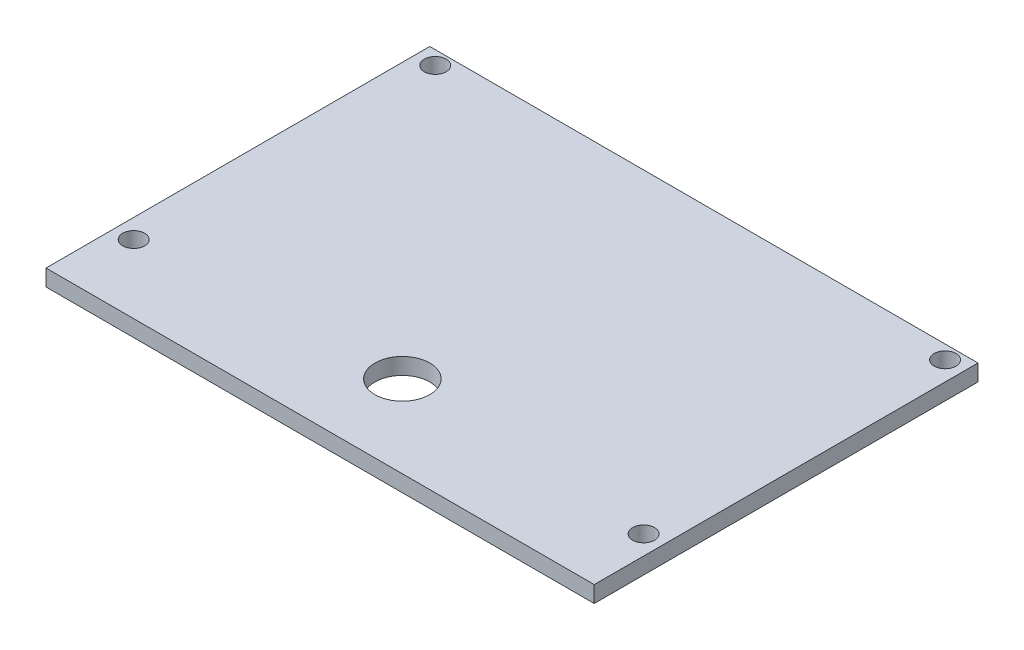
ISO-10303-21;
HEADER;
FILE_DESCRIPTION(('STEP AP214'),'2;1');
FILE_NAME('part.step','',(''),(''),'','','');
FILE_SCHEMA(('AUTOMOTIVE_DESIGN { 1 0 10303 214 1 1 1 1 }'));
ENDSEC;
DATA;
#1=APPLICATION_CONTEXT('core data for automotive mechanical design processes');
#2=APPLICATION_PROTOCOL_DEFINITION('international standard','automotive_design',2000,#1);
#3=PRODUCT_CONTEXT('',#1,'mechanical');
#4=PRODUCT('Part','Part','',(#3));
#5=PRODUCT_RELATED_PRODUCT_CATEGORY('part','',(#4));
#6=PRODUCT_DEFINITION_FORMATION('','',#4);
#7=PRODUCT_DEFINITION_CONTEXT('part definition',#1,'design');
#8=PRODUCT_DEFINITION('design','',#6,#7);
#9=PRODUCT_DEFINITION_SHAPE('','',#8);
#10=(LENGTH_UNIT() NAMED_UNIT(*) SI_UNIT(.MILLI.,.METRE.));
#11=(NAMED_UNIT(*) PLANE_ANGLE_UNIT() SI_UNIT($,.RADIAN.));
#12=(NAMED_UNIT(*) SI_UNIT($,.STERADIAN.) SOLID_ANGLE_UNIT());
#13=UNCERTAINTY_MEASURE_WITH_UNIT(LENGTH_MEASURE(1.E-05),#10,'distance_accuracy_value','');
#14=(GEOMETRIC_REPRESENTATION_CONTEXT(3) GLOBAL_UNCERTAINTY_ASSIGNED_CONTEXT((#13)) GLOBAL_UNIT_ASSIGNED_CONTEXT((#10,
#11,#12)) REPRESENTATION_CONTEXT('',''));
#15=CARTESIAN_POINT('',(0.,0.,0.));
#16=DIRECTION('',(0.,0.,1.));
#17=DIRECTION('',(1.,0.,0.));
#18=AXIS2_PLACEMENT_3D('',#15,#16,#17);
#19=CARTESIAN_POINT('',(0.,3.,0.));
#20=DIRECTION('',(0.,1.,0.));
#21=DIRECTION('',(0.,0.,1.));
#22=AXIS2_PLACEMENT_3D('',#19,#20,#21);
#23=PLANE('',#22);
#24=CARTESIAN_POINT('',(82.0549090511385,3.,50.4503105590062));
#25=DIRECTION('',(0.,1.,0.));
#26=DIRECTION('',(0.,0.,1.));
#27=AXIS2_PLACEMENT_3D('',#24,#25,#26);
#28=CIRCLE('',#27,2.);
#29=CARTESIAN_POINT('',(82.0549090511385,3.,52.4503105590062));
#30=VERTEX_POINT('',#29);
#31=EDGE_CURVE('E127',#30,#30,#28,.T.);
#32=ORIENTED_EDGE('',*,*,#31,.F.);
#33=EDGE_LOOP('',(#32));
#34=FACE_BOUND('',#33,.T.);
#35=CARTESIAN_POINT('',(82.0549090511385,3.,-4.54968944099379));
#36=DIRECTION('',(0.,1.,0.));
#37=DIRECTION('',(0.,0.,1.));
#38=AXIS2_PLACEMENT_3D('',#35,#36,#37);
#39=CIRCLE('',#38,2.);
#40=CARTESIAN_POINT('',(82.0549090511385,3.,-2.5496894409938));
#41=VERTEX_POINT('',#40);
#42=EDGE_CURVE('E115',#41,#41,#39,.T.);
#43=ORIENTED_EDGE('',*,*,#42,.F.);
#44=EDGE_LOOP('',(#43));
#45=FACE_BOUND('',#44,.T.);
#46=DIRECTION('',(0.,0.,1.));
#47=VECTOR('',#46,1.);
#48=CARTESIAN_POINT('',(-14.4450909488615,3.,-7.04968944099379));
#49=LINE('',#48,#47);
#50=CARTESIAN_POINT('',(-14.4450909488615,3.,-7.04968944099379));
#51=VERTEX_POINT('',#50);
#52=CARTESIAN_POINT('',(-14.4450909488615,3.,62.9503105590062));
#53=VERTEX_POINT('',#52);
#54=EDGE_CURVE('E85',#51,#53,#49,.T.);
#55=ORIENTED_EDGE('',*,*,#54,.T.);
#56=DIRECTION('',(1.,0.,0.));
#57=VECTOR('',#56,1.);
#58=CARTESIAN_POINT('',(-14.4450909488615,3.,62.9503105590062));
#59=LINE('',#58,#57);
#60=CARTESIAN_POINT('',(85.5549090511385,3.,62.9503105590062));
#61=VERTEX_POINT('',#60);
#62=EDGE_CURVE('E80',#53,#61,#59,.T.);
#63=ORIENTED_EDGE('',*,*,#62,.T.);
#64=DIRECTION('',(0.,0.,-1.));
#65=VECTOR('',#64,1.);
#66=CARTESIAN_POINT('',(85.5549090511385,3.,-7.04968944099379));
#67=LINE('',#66,#65);
#68=CARTESIAN_POINT('',(85.5549090511385,3.,-7.04968944099379));
#69=VERTEX_POINT('',#68);
#70=EDGE_CURVE('E83',#61,#69,#67,.T.);
#71=ORIENTED_EDGE('',*,*,#70,.T.);
#72=DIRECTION('',(-1.,0.,0.));
#73=VECTOR('',#72,1.);
#74=CARTESIAN_POINT('',(-14.4450909488615,3.,-7.04968944099379));
#75=LINE('',#74,#73);
#76=EDGE_CURVE('E50',#69,#51,#75,.T.);
#77=ORIENTED_EDGE('',*,*,#76,.T.);
#78=EDGE_LOOP('',(#55,#63,#71,#77));
#79=FACE_BOUND('',#78,.T.);
#80=CARTESIAN_POINT('',(-10.9450909488615,3.,-4.54968944099379));
#81=DIRECTION('',(0.,1.,0.));
#82=DIRECTION('',(0.,0.,1.));
#83=AXIS2_PLACEMENT_3D('',#80,#81,#82);
#84=CIRCLE('',#83,2.);
#85=CARTESIAN_POINT('',(-10.9450909488615,3.,-2.54968944099379));
#86=VERTEX_POINT('',#85);
#87=EDGE_CURVE('E100',#86,#86,#84,.T.);
#88=ORIENTED_EDGE('',*,*,#87,.F.);
#89=EDGE_LOOP('',(#88));
#90=FACE_BOUND('',#89,.T.);
#91=CARTESIAN_POINT('',(-10.9450909488615,3.,50.4503105590062));
#92=DIRECTION('',(0.,1.,0.));
#93=DIRECTION('',(0.,0.,1.));
#94=AXIS2_PLACEMENT_3D('',#91,#92,#93);
#95=CIRCLE('',#94,2.);
#96=CARTESIAN_POINT('',(-10.9450909488615,3.,52.4503105590062));
#97=VERTEX_POINT('',#96);
#98=EDGE_CURVE('E121',#97,#97,#95,.T.);
#99=ORIENTED_EDGE('',*,*,#98,.F.);
#100=EDGE_LOOP('',(#99));
#101=FACE_BOUND('',#100,.T.);
#102=CARTESIAN_POINT('',(35.5549090511385,3.,47.9503105590062));
#103=DIRECTION('',(0.,1.,0.));
#104=DIRECTION('',(0.,0.,1.));
#105=AXIS2_PLACEMENT_3D('',#102,#103,#104);
#106=CIRCLE('',#105,5.);
#107=CARTESIAN_POINT('',(35.5549090511385,3.,52.9503105590062));
#108=VERTEX_POINT('',#107);
#109=EDGE_CURVE('E133',#108,#108,#106,.T.);
#110=ORIENTED_EDGE('',*,*,#109,.F.);
#111=EDGE_LOOP('',(#110));
#112=FACE_BOUND('',#111,.T.);
#113=ADVANCED_FACE('F33',(#34,#45,#79,#90,#101,#112),#23,.T.);
#114=CARTESIAN_POINT('',(0.,0.,0.));
#115=DIRECTION('',(0.,1.,0.));
#116=DIRECTION('',(0.,0.,1.));
#117=AXIS2_PLACEMENT_3D('',#114,#115,#116);
#118=PLANE('',#117);
#119=CARTESIAN_POINT('',(82.0549090511385,0.,50.4503105590062));
#120=DIRECTION('',(0.,1.,0.));
#121=DIRECTION('',(0.,0.,1.));
#122=AXIS2_PLACEMENT_3D('',#119,#120,#121);
#123=CIRCLE('',#122,2.);
#124=CARTESIAN_POINT('',(82.0549090511385,0.,52.4503105590062));
#125=VERTEX_POINT('',#124);
#126=EDGE_CURVE('E130',#125,#125,#123,.T.);
#127=ORIENTED_EDGE('',*,*,#126,.T.);
#128=EDGE_LOOP('',(#127));
#129=FACE_BOUND('',#128,.T.);
#130=CARTESIAN_POINT('',(82.0549090511385,0.,-4.54968944099379));
#131=DIRECTION('',(0.,1.,0.));
#132=DIRECTION('',(0.,0.,1.));
#133=AXIS2_PLACEMENT_3D('',#130,#131,#132);
#134=CIRCLE('',#133,2.);
#135=CARTESIAN_POINT('',(82.0549090511385,0.,-2.5496894409938));
#136=VERTEX_POINT('',#135);
#137=EDGE_CURVE('E118',#136,#136,#134,.T.);
#138=ORIENTED_EDGE('',*,*,#137,.T.);
#139=EDGE_LOOP('',(#138));
#140=FACE_BOUND('',#139,.T.);
#141=DIRECTION('',(0.,0.,1.));
#142=VECTOR('',#141,1.);
#143=CARTESIAN_POINT('',(-14.4450909488615,0.,-7.04968944099379));
#144=LINE('',#143,#142);
#145=CARTESIAN_POINT('',(-14.4450909488615,0.,-7.04968944099379));
#146=VERTEX_POINT('',#145);
#147=CARTESIAN_POINT('',(-14.4450909488615,0.,62.9503105590062));
#148=VERTEX_POINT('',#147);
#149=EDGE_CURVE('E97',#146,#148,#144,.T.);
#150=ORIENTED_EDGE('',*,*,#149,.F.);
#151=DIRECTION('',(-1.,0.,0.));
#152=VECTOR('',#151,1.);
#153=CARTESIAN_POINT('',(-14.4450909488615,0.,-7.04968944099379));
#154=LINE('',#153,#152);
#155=CARTESIAN_POINT('',(85.5549090511385,0.,-7.04968944099379));
#156=VERTEX_POINT('',#155);
#157=EDGE_CURVE('E73',#156,#146,#154,.T.);
#158=ORIENTED_EDGE('',*,*,#157,.F.);
#159=DIRECTION('',(0.,0.,-1.));
#160=VECTOR('',#159,1.);
#161=CARTESIAN_POINT('',(85.5549090511385,0.,-7.04968944099379));
#162=LINE('',#161,#160);
#163=CARTESIAN_POINT('',(85.5549090511385,0.,62.9503105590062));
#164=VERTEX_POINT('',#163);
#165=EDGE_CURVE('E67',#164,#156,#162,.T.);
#166=ORIENTED_EDGE('',*,*,#165,.F.);
#167=DIRECTION('',(1.,0.,0.));
#168=VECTOR('',#167,1.);
#169=CARTESIAN_POINT('',(-14.4450909488615,0.,62.9503105590062));
#170=LINE('',#169,#168);
#171=EDGE_CURVE('E89',#148,#164,#170,.T.);
#172=ORIENTED_EDGE('',*,*,#171,.F.);
#173=EDGE_LOOP('',(#150,#158,#166,#172));
#174=FACE_BOUND('',#173,.T.);
#175=CARTESIAN_POINT('',(-10.9450909488615,0.,-4.54968944099379));
#176=DIRECTION('',(0.,1.,0.));
#177=DIRECTION('',(0.,0.,1.));
#178=AXIS2_PLACEMENT_3D('',#175,#176,#177);
#179=CIRCLE('',#178,2.);
#180=CARTESIAN_POINT('',(-10.9450909488615,0.,-2.54968944099379));
#181=VERTEX_POINT('',#180);
#182=EDGE_CURVE('E112',#181,#181,#179,.T.);
#183=ORIENTED_EDGE('',*,*,#182,.T.);
#184=EDGE_LOOP('',(#183));
#185=FACE_BOUND('',#184,.T.);
#186=CARTESIAN_POINT('',(-10.9450909488615,0.,50.4503105590062));
#187=DIRECTION('',(0.,1.,0.));
#188=DIRECTION('',(0.,0.,1.));
#189=AXIS2_PLACEMENT_3D('',#186,#187,#188);
#190=CIRCLE('',#189,2.);
#191=CARTESIAN_POINT('',(-10.9450909488615,0.,52.4503105590062));
#192=VERTEX_POINT('',#191);
#193=EDGE_CURVE('E124',#192,#192,#190,.T.);
#194=ORIENTED_EDGE('',*,*,#193,.T.);
#195=EDGE_LOOP('',(#194));
#196=FACE_BOUND('',#195,.T.);
#197=CARTESIAN_POINT('',(35.5549090511385,0.,47.9503105590062));
#198=DIRECTION('',(0.,1.,0.));
#199=DIRECTION('',(0.,0.,1.));
#200=AXIS2_PLACEMENT_3D('',#197,#198,#199);
#201=CIRCLE('',#200,5.);
#202=CARTESIAN_POINT('',(35.5549090511385,0.,52.9503105590062));
#203=VERTEX_POINT('',#202);
#204=EDGE_CURVE('E136',#203,#203,#201,.T.);
#205=ORIENTED_EDGE('',*,*,#204,.T.);
#206=EDGE_LOOP('',(#205));
#207=FACE_BOUND('',#206,.T.);
#208=ADVANCED_FACE('F108',(#129,#140,#174,#185,#196,#207),#118,.F.);
#209=CARTESIAN_POINT('',(-14.4450909488615,3.,-7.04968944099379));
#210=DIRECTION('',(1.,0.,0.));
#211=DIRECTION('',(0.,0.,-1.));
#212=AXIS2_PLACEMENT_3D('',#209,#210,#211);
#213=PLANE('',#212);
#214=ORIENTED_EDGE('',*,*,#149,.T.);
#215=DIRECTION('',(0.,-1.,0.));
#216=VECTOR('',#215,1.);
#217=CARTESIAN_POINT('',(-14.4450909488615,3.,62.9503105590062));
#218=LINE('',#217,#216);
#219=EDGE_CURVE('E11',#53,#148,#218,.T.);
#220=ORIENTED_EDGE('',*,*,#219,.F.);
#221=ORIENTED_EDGE('',*,*,#54,.F.);
#222=DIRECTION('',(0.,-1.,0.));
#223=VECTOR('',#222,1.);
#224=CARTESIAN_POINT('',(-14.4450909488615,3.,-7.04968944099379));
#225=LINE('',#224,#223);
#226=EDGE_CURVE('E93',#51,#146,#225,.T.);
#227=ORIENTED_EDGE('',*,*,#226,.T.);
#228=EDGE_LOOP('',(#214,#220,#221,#227));
#229=FACE_BOUND('',#228,.T.);
#230=ADVANCED_FACE('F35',(#229),#213,.F.);
#231=CARTESIAN_POINT('',(-14.4450909488615,3.,62.9503105590062));
#232=DIRECTION('',(0.,0.,-1.));
#233=DIRECTION('',(-1.,0.,0.));
#234=AXIS2_PLACEMENT_3D('',#231,#232,#233);
#235=PLANE('',#234);
#236=ORIENTED_EDGE('',*,*,#171,.T.);
#237=DIRECTION('',(0.,-1.,0.));
#238=VECTOR('',#237,1.);
#239=CARTESIAN_POINT('',(85.5549090511385,3.,62.9503105590062));
#240=LINE('',#239,#238);
#241=EDGE_CURVE('E42',#61,#164,#240,.T.);
#242=ORIENTED_EDGE('',*,*,#241,.F.);
#243=ORIENTED_EDGE('',*,*,#62,.F.);
#244=ORIENTED_EDGE('',*,*,#219,.T.);
#245=EDGE_LOOP('',(#236,#242,#243,#244));
#246=FACE_BOUND('',#245,.T.);
#247=ADVANCED_FACE('F88',(#246),#235,.F.);
#248=CARTESIAN_POINT('',(85.5549090511385,3.,-7.04968944099379));
#249=DIRECTION('',(-1.,0.,0.));
#250=DIRECTION('',(0.,0.,1.));
#251=AXIS2_PLACEMENT_3D('',#248,#249,#250);
#252=PLANE('',#251);
#253=ORIENTED_EDGE('',*,*,#165,.T.);
#254=DIRECTION('',(0.,-1.,0.));
#255=VECTOR('',#254,1.);
#256=CARTESIAN_POINT('',(85.5549090511385,3.,-7.04968944099379));
#257=LINE('',#256,#255);
#258=EDGE_CURVE('E90',#69,#156,#257,.T.);
#259=ORIENTED_EDGE('',*,*,#258,.F.);
#260=ORIENTED_EDGE('',*,*,#70,.F.);
#261=ORIENTED_EDGE('',*,*,#241,.T.);
#262=EDGE_LOOP('',(#253,#259,#260,#261));
#263=FACE_BOUND('',#262,.T.);
#264=ADVANCED_FACE('F91',(#263),#252,.F.);
#265=CARTESIAN_POINT('',(-14.4450909488615,3.,-7.04968944099379));
#266=DIRECTION('',(0.,0.,1.));
#267=DIRECTION('',(1.,0.,0.));
#268=AXIS2_PLACEMENT_3D('',#265,#266,#267);
#269=PLANE('',#268);
#270=ORIENTED_EDGE('',*,*,#157,.T.);
#271=ORIENTED_EDGE('',*,*,#226,.F.);
#272=ORIENTED_EDGE('',*,*,#76,.F.);
#273=ORIENTED_EDGE('',*,*,#258,.T.);
#274=EDGE_LOOP('',(#270,#271,#272,#273));
#275=FACE_BOUND('',#274,.T.);
#276=ADVANCED_FACE('F105',(#275),#269,.F.);
#277=CARTESIAN_POINT('',(-10.9450909488615,3.,-4.54968944099379));
#278=DIRECTION('',(0.,-1.,0.));
#279=DIRECTION('',(0.,0.,-1.));
#280=AXIS2_PLACEMENT_3D('',#277,#278,#279);
#281=CYLINDRICAL_SURFACE('',#280,2.);
#282=ORIENTED_EDGE('',*,*,#87,.T.);
#283=EDGE_LOOP('',(#282));
#284=FACE_BOUND('',#283,.T.);
#285=ORIENTED_EDGE('',*,*,#182,.F.);
#286=EDGE_LOOP('',(#285));
#287=FACE_BOUND('',#286,.T.);
#288=ADVANCED_FACE('F156',(#284,#287),#281,.F.);
#289=CARTESIAN_POINT('',(82.0549090511385,3.,-4.54968944099379));
#290=DIRECTION('',(0.,-1.,0.));
#291=DIRECTION('',(0.,0.,-1.));
#292=AXIS2_PLACEMENT_3D('',#289,#290,#291);
#293=CYLINDRICAL_SURFACE('',#292,2.);
#294=ORIENTED_EDGE('',*,*,#42,.T.);
#295=EDGE_LOOP('',(#294));
#296=FACE_BOUND('',#295,.T.);
#297=ORIENTED_EDGE('',*,*,#137,.F.);
#298=EDGE_LOOP('',(#297));
#299=FACE_BOUND('',#298,.T.);
#300=ADVANCED_FACE('F202',(#296,#299),#293,.F.);
#301=CARTESIAN_POINT('',(-10.9450909488615,3.,50.4503105590062));
#302=DIRECTION('',(0.,-1.,0.));
#303=DIRECTION('',(0.,0.,-1.));
#304=AXIS2_PLACEMENT_3D('',#301,#302,#303);
#305=CYLINDRICAL_SURFACE('',#304,2.);
#306=ORIENTED_EDGE('',*,*,#98,.T.);
#307=EDGE_LOOP('',(#306));
#308=FACE_BOUND('',#307,.T.);
#309=ORIENTED_EDGE('',*,*,#193,.F.);
#310=EDGE_LOOP('',(#309));
#311=FACE_BOUND('',#310,.T.);
#312=ADVANCED_FACE('F210',(#308,#311),#305,.F.);
#313=CARTESIAN_POINT('',(82.0549090511385,3.,50.4503105590062));
#314=DIRECTION('',(0.,-1.,0.));
#315=DIRECTION('',(0.,0.,-1.));
#316=AXIS2_PLACEMENT_3D('',#313,#314,#315);
#317=CYLINDRICAL_SURFACE('',#316,2.);
#318=ORIENTED_EDGE('',*,*,#31,.T.);
#319=EDGE_LOOP('',(#318));
#320=FACE_BOUND('',#319,.T.);
#321=ORIENTED_EDGE('',*,*,#126,.F.);
#322=EDGE_LOOP('',(#321));
#323=FACE_BOUND('',#322,.T.);
#324=ADVANCED_FACE('F218',(#320,#323),#317,.F.);
#325=CARTESIAN_POINT('',(35.5549090511385,3.,47.9503105590062));
#326=DIRECTION('',(0.,-1.,0.));
#327=DIRECTION('',(0.,0.,-1.));
#328=AXIS2_PLACEMENT_3D('',#325,#326,#327);
#329=CYLINDRICAL_SURFACE('',#328,5.);
#330=ORIENTED_EDGE('',*,*,#109,.T.);
#331=EDGE_LOOP('',(#330));
#332=FACE_BOUND('',#331,.T.);
#333=ORIENTED_EDGE('',*,*,#204,.F.);
#334=EDGE_LOOP('',(#333));
#335=FACE_BOUND('',#334,.T.);
#336=ADVANCED_FACE('F142',(#332,#335),#329,.F.);
#337=CLOSED_SHELL('',(#113,#208,#230,#247,#264,#276,#288,#300,#312,#324,#336));
#338=MANIFOLD_SOLID_BREP('B2',#337);
#339=ADVANCED_BREP_SHAPE_REPRESENTATION('',(#18,#338),#14);
#340=SHAPE_DEFINITION_REPRESENTATION(#9,#339);
ENDSEC;
END-ISO-10303-21;
